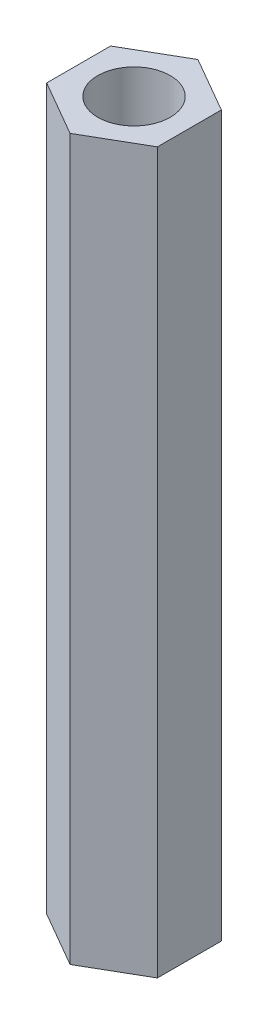
ISO-10303-21;
HEADER;
FILE_DESCRIPTION(('STEP AP214'),'2;1');
FILE_NAME('part.step','',(''),(''),'','','');
FILE_SCHEMA(('AUTOMOTIVE_DESIGN { 1 0 10303 214 1 1 1 1 }'));
ENDSEC;
DATA;
#1=APPLICATION_CONTEXT('core data for automotive mechanical design processes');
#2=APPLICATION_PROTOCOL_DEFINITION('international standard','automotive_design',2000,#1);
#3=PRODUCT_CONTEXT('',#1,'mechanical');
#4=PRODUCT('Part','Part','',(#3));
#5=PRODUCT_RELATED_PRODUCT_CATEGORY('part','',(#4));
#6=PRODUCT_DEFINITION_FORMATION('','',#4);
#7=PRODUCT_DEFINITION_CONTEXT('part definition',#1,'design');
#8=PRODUCT_DEFINITION('design','',#6,#7);
#9=PRODUCT_DEFINITION_SHAPE('','',#8);
#10=(LENGTH_UNIT() NAMED_UNIT(*) SI_UNIT(.MILLI.,.METRE.));
#11=(NAMED_UNIT(*) PLANE_ANGLE_UNIT() SI_UNIT($,.RADIAN.));
#12=(NAMED_UNIT(*) SI_UNIT($,.STERADIAN.) SOLID_ANGLE_UNIT());
#13=UNCERTAINTY_MEASURE_WITH_UNIT(LENGTH_MEASURE(1.E-05),#10,'distance_accuracy_value','');
#14=(GEOMETRIC_REPRESENTATION_CONTEXT(3) GLOBAL_UNCERTAINTY_ASSIGNED_CONTEXT((#13)) GLOBAL_UNIT_ASSIGNED_CONTEXT((#10,
#11,#12)) REPRESENTATION_CONTEXT('',''));
#15=CARTESIAN_POINT('',(0.,0.,0.));
#16=DIRECTION('',(0.,0.,1.));
#17=DIRECTION('',(1.,0.,0.));
#18=AXIS2_PLACEMENT_3D('',#15,#16,#17);
#19=CARTESIAN_POINT('',(0.,32.5,0.));
#20=DIRECTION('',(0.,-1.,0.));
#21=DIRECTION('',(0.,0.,-1.));
#22=AXIS2_PLACEMENT_3D('',#19,#20,#21);
#23=PLANE('',#22);
#24=DIRECTION('',(-0.86602542888642,0.,-0.49999995652209));
#25=VECTOR('',#24,1.);
#26=CARTESIAN_POINT('',(-1.44938846189692E-07,32.5,-2.887));
#27=LINE('',#26,#25);
#28=CARTESIAN_POINT('',(2.50021526825625,32.5,-1.44350012552072));
#29=VERTEX_POINT('',#28);
#30=CARTESIAN_POINT('',(-1.44938846189692E-07,32.5,-2.887));
#31=VERTEX_POINT('',#30);
#32=EDGE_CURVE('E130',#29,#31,#27,.T.);
#33=ORIENTED_EDGE('',*,*,#32,.T.);
#34=DIRECTION('',(-0.866025378682455,0.,0.500000043477908));
#35=VECTOR('',#34,1.);
#36=CARTESIAN_POINT('',(-2.50021541319509,32.5,-1.44349987447928));
#37=LINE('',#36,#35);
#38=CARTESIAN_POINT('',(-2.50021541319509,32.5,-1.44349987447928));
#39=VERTEX_POINT('',#38);
#40=EDGE_CURVE('E88',#31,#39,#37,.T.);
#41=ORIENTED_EDGE('',*,*,#40,.T.);
#42=DIRECTION('',(5.02039646973577E-08,0.,0.999999999999999));
#43=VECTOR('',#42,1.);
#44=CARTESIAN_POINT('',(-2.50021526825625,32.5,1.44350012552072));
#45=LINE('',#44,#43);
#46=CARTESIAN_POINT('',(-2.50021526825625,32.5,1.44350012552072));
#47=VERTEX_POINT('',#46);
#48=EDGE_CURVE('E101',#39,#47,#45,.T.);
#49=ORIENTED_EDGE('',*,*,#48,.T.);
#50=DIRECTION('',(0.86602542888642,0.,0.49999995652209));
#51=VECTOR('',#50,1.);
#52=CARTESIAN_POINT('',(1.44938846487848E-07,32.5,2.887));
#53=LINE('',#52,#51);
#54=CARTESIAN_POINT('',(1.44938846487848E-07,32.5,2.887));
#55=VERTEX_POINT('',#54);
#56=EDGE_CURVE('E95',#47,#55,#53,.T.);
#57=ORIENTED_EDGE('',*,*,#56,.T.);
#58=DIRECTION('',(0.866025378682455,0.,-0.500000043477908));
#59=VECTOR('',#58,1.);
#60=CARTESIAN_POINT('',(2.50021541319509,32.5,1.44349987447928));
#61=LINE('',#60,#59);
#62=CARTESIAN_POINT('',(2.50021541319509,32.5,1.44349987447928));
#63=VERTEX_POINT('',#62);
#64=EDGE_CURVE('E99',#55,#63,#61,.T.);
#65=ORIENTED_EDGE('',*,*,#64,.T.);
#66=DIRECTION('',(-5.02039645471391E-08,0.,-0.999999999999999));
#67=VECTOR('',#66,1.);
#68=CARTESIAN_POINT('',(2.50021526825625,32.5,-1.44350012552072));
#69=LINE('',#68,#67);
#70=EDGE_CURVE('E51',#63,#29,#69,.T.);
#71=ORIENTED_EDGE('',*,*,#70,.T.);
#72=EDGE_LOOP('',(#33,#41,#49,#57,#65,#71));
#73=FACE_BOUND('',#72,.T.);
#74=CARTESIAN_POINT('',(0.,32.5,0.));
#75=DIRECTION('',(0.,1.,0.));
#76=DIRECTION('',(0.,0.,1.));
#77=AXIS2_PLACEMENT_3D('',#74,#75,#76);
#78=CIRCLE('',#77,1.635);
#79=CARTESIAN_POINT('',(0.,32.5,1.635));
#80=VERTEX_POINT('',#79);
#81=EDGE_CURVE('E123',#80,#80,#78,.T.);
#82=ORIENTED_EDGE('',*,*,#81,.F.);
#83=EDGE_LOOP('',(#82));
#84=FACE_BOUND('',#83,.T.);
#85=ADVANCED_FACE('F34',(#73,#84),#23,.F.);
#86=CARTESIAN_POINT('',(0.,0.,0.));
#87=DIRECTION('',(0.,-1.,0.));
#88=DIRECTION('',(0.,0.,-1.));
#89=AXIS2_PLACEMENT_3D('',#86,#87,#88);
#90=PLANE('',#89);
#91=DIRECTION('',(-0.86602542888642,0.,-0.49999995652209));
#92=VECTOR('',#91,1.);
#93=CARTESIAN_POINT('',(-1.44938846189692E-07,0.,-2.887));
#94=LINE('',#93,#92);
#95=CARTESIAN_POINT('',(2.50021526825625,0.,-1.44350012552072));
#96=VERTEX_POINT('',#95);
#97=CARTESIAN_POINT('',(-1.44938846189692E-07,0.,-2.887));
#98=VERTEX_POINT('',#97);
#99=EDGE_CURVE('E119',#96,#98,#94,.T.);
#100=ORIENTED_EDGE('',*,*,#99,.F.);
#101=DIRECTION('',(-5.02039645471391E-08,0.,-0.999999999999999));
#102=VECTOR('',#101,1.);
#103=CARTESIAN_POINT('',(2.50021526825625,0.,-1.44350012552072));
#104=LINE('',#103,#102);
#105=CARTESIAN_POINT('',(2.50021541319509,0.,1.44349987447928));
#106=VERTEX_POINT('',#105);
#107=EDGE_CURVE('E80',#106,#96,#104,.T.);
#108=ORIENTED_EDGE('',*,*,#107,.F.);
#109=DIRECTION('',(0.866025378682455,0.,-0.500000043477908));
#110=VECTOR('',#109,1.);
#111=CARTESIAN_POINT('',(2.50021541319509,0.,1.44349987447928));
#112=LINE('',#111,#110);
#113=CARTESIAN_POINT('',(1.44938846487848E-07,0.,2.887));
#114=VERTEX_POINT('',#113);
#115=EDGE_CURVE('E74',#114,#106,#112,.T.);
#116=ORIENTED_EDGE('',*,*,#115,.F.);
#117=DIRECTION('',(0.86602542888642,0.,0.49999995652209));
#118=VECTOR('',#117,1.);
#119=CARTESIAN_POINT('',(1.44938846487848E-07,0.,2.887));
#120=LINE('',#119,#118);
#121=CARTESIAN_POINT('',(-2.50021526825625,0.,1.44350012552072));
#122=VERTEX_POINT('',#121);
#123=EDGE_CURVE('E109',#122,#114,#120,.T.);
#124=ORIENTED_EDGE('',*,*,#123,.F.);
#125=DIRECTION('',(5.02039646973577E-08,0.,0.999999999999999));
#126=VECTOR('',#125,1.);
#127=CARTESIAN_POINT('',(-2.50021526825625,0.,1.44350012552072));
#128=LINE('',#127,#126);
#129=CARTESIAN_POINT('',(-2.50021541319509,0.,-1.44349987447928));
#130=VERTEX_POINT('',#129);
#131=EDGE_CURVE('E125',#130,#122,#128,.T.);
#132=ORIENTED_EDGE('',*,*,#131,.F.);
#133=DIRECTION('',(-0.866025378682455,0.,0.500000043477908));
#134=VECTOR('',#133,1.);
#135=CARTESIAN_POINT('',(-2.50021541319509,0.,-1.44349987447928));
#136=LINE('',#135,#134);
#137=EDGE_CURVE('E122',#98,#130,#136,.T.);
#138=ORIENTED_EDGE('',*,*,#137,.F.);
#139=EDGE_LOOP('',(#100,#108,#116,#124,#132,#138));
#140=FACE_BOUND('',#139,.T.);
#141=CARTESIAN_POINT('',(0.,0.,0.));
#142=DIRECTION('',(0.,1.,0.));
#143=DIRECTION('',(0.,0.,1.));
#144=AXIS2_PLACEMENT_3D('',#141,#142,#143);
#145=CIRCLE('',#144,1.635);
#146=CARTESIAN_POINT('',(0.,0.,1.635));
#147=VERTEX_POINT('',#146);
#148=EDGE_CURVE('E223',#147,#147,#145,.T.);
#149=ORIENTED_EDGE('',*,*,#148,.T.);
#150=EDGE_LOOP('',(#149));
#151=FACE_BOUND('',#150,.T.);
#152=ADVANCED_FACE('F139',(#140,#151),#90,.T.);
#153=CARTESIAN_POINT('',(-1.44938846189692E-07,32.5,-2.887));
#154=DIRECTION('',(-0.49999995652209,0.,0.86602542888642));
#155=DIRECTION('',(0.86602542888642,0.,0.49999995652209));
#156=AXIS2_PLACEMENT_3D('',#153,#154,#155);
#157=PLANE('',#156);
#158=ORIENTED_EDGE('',*,*,#99,.T.);
#159=DIRECTION('',(0.,-1.,0.));
#160=VECTOR('',#159,1.);
#161=CARTESIAN_POINT('',(-1.44938846189692E-07,32.5,-2.887));
#162=LINE('',#161,#160);
#163=EDGE_CURVE('E11',#31,#98,#162,.T.);
#164=ORIENTED_EDGE('',*,*,#163,.F.);
#165=ORIENTED_EDGE('',*,*,#32,.F.);
#166=DIRECTION('',(0.,-1.,0.));
#167=VECTOR('',#166,1.);
#168=CARTESIAN_POINT('',(2.50021526825625,32.5,-1.44350012552072));
#169=LINE('',#168,#167);
#170=EDGE_CURVE('E115',#29,#96,#169,.T.);
#171=ORIENTED_EDGE('',*,*,#170,.T.);
#172=EDGE_LOOP('',(#158,#164,#165,#171));
#173=FACE_BOUND('',#172,.T.);
#174=ADVANCED_FACE('F36',(#173),#157,.F.);
#175=CARTESIAN_POINT('',(-2.50021541319509,32.5,-1.44349987447928));
#176=DIRECTION('',(0.500000043477908,0.,0.866025378682455));
#177=DIRECTION('',(0.866025378682455,0.,-0.500000043477908));
#178=AXIS2_PLACEMENT_3D('',#175,#176,#177);
#179=PLANE('',#178);
#180=ORIENTED_EDGE('',*,*,#137,.T.);
#181=DIRECTION('',(0.,-1.,0.));
#182=VECTOR('',#181,1.);
#183=CARTESIAN_POINT('',(-2.50021541319509,32.5,-1.44349987447928));
#184=LINE('',#183,#182);
#185=EDGE_CURVE('E43',#39,#130,#184,.T.);
#186=ORIENTED_EDGE('',*,*,#185,.F.);
#187=ORIENTED_EDGE('',*,*,#40,.F.);
#188=ORIENTED_EDGE('',*,*,#163,.T.);
#189=EDGE_LOOP('',(#180,#186,#187,#188));
#190=FACE_BOUND('',#189,.T.);
#191=ADVANCED_FACE('F164',(#190),#179,.F.);
#192=CARTESIAN_POINT('',(-2.50021526825625,32.5,1.44350012552072));
#193=DIRECTION('',(0.999999999999999,0.,-5.02039646973576E-08));
#194=DIRECTION('',(-5.02039646973577E-08,0.,-0.999999999999999));
#195=AXIS2_PLACEMENT_3D('',#192,#193,#194);
#196=PLANE('',#195);
#197=ORIENTED_EDGE('',*,*,#131,.T.);
#198=DIRECTION('',(0.,-1.,0.));
#199=VECTOR('',#198,1.);
#200=CARTESIAN_POINT('',(-2.50021526825625,32.5,1.44350012552072));
#201=LINE('',#200,#199);
#202=EDGE_CURVE('E110',#47,#122,#201,.T.);
#203=ORIENTED_EDGE('',*,*,#202,.F.);
#204=ORIENTED_EDGE('',*,*,#48,.F.);
#205=ORIENTED_EDGE('',*,*,#185,.T.);
#206=EDGE_LOOP('',(#197,#203,#204,#205));
#207=FACE_BOUND('',#206,.T.);
#208=ADVANCED_FACE('F136',(#207),#196,.F.);
#209=CARTESIAN_POINT('',(1.44938846487848E-07,32.5,2.887));
#210=DIRECTION('',(0.49999995652209,0.,-0.86602542888642));
#211=DIRECTION('',(-0.86602542888642,0.,-0.49999995652209));
#212=AXIS2_PLACEMENT_3D('',#209,#210,#211);
#213=PLANE('',#212);
#214=ORIENTED_EDGE('',*,*,#123,.T.);
#215=DIRECTION('',(0.,-1.,0.));
#216=VECTOR('',#215,1.);
#217=CARTESIAN_POINT('',(1.44938846487848E-07,32.5,2.887));
#218=LINE('',#217,#216);
#219=EDGE_CURVE('E106',#55,#114,#218,.T.);
#220=ORIENTED_EDGE('',*,*,#219,.F.);
#221=ORIENTED_EDGE('',*,*,#56,.F.);
#222=ORIENTED_EDGE('',*,*,#202,.T.);
#223=EDGE_LOOP('',(#214,#220,#221,#222));
#224=FACE_BOUND('',#223,.T.);
#225=ADVANCED_FACE('F107',(#224),#213,.F.);
#226=CARTESIAN_POINT('',(2.50021541319509,32.5,1.44349987447928));
#227=DIRECTION('',(-0.500000043477908,0.,-0.866025378682455));
#228=DIRECTION('',(-0.866025378682455,0.,0.500000043477908));
#229=AXIS2_PLACEMENT_3D('',#226,#227,#228);
#230=PLANE('',#229);
#231=ORIENTED_EDGE('',*,*,#115,.T.);
#232=DIRECTION('',(0.,-1.,0.));
#233=VECTOR('',#232,1.);
#234=CARTESIAN_POINT('',(2.50021541319509,32.5,1.44349987447928));
#235=LINE('',#234,#233);
#236=EDGE_CURVE('E111',#63,#106,#235,.T.);
#237=ORIENTED_EDGE('',*,*,#236,.F.);
#238=ORIENTED_EDGE('',*,*,#64,.F.);
#239=ORIENTED_EDGE('',*,*,#219,.T.);
#240=EDGE_LOOP('',(#231,#237,#238,#239));
#241=FACE_BOUND('',#240,.T.);
#242=ADVANCED_FACE('F113',(#241),#230,.F.);
#243=CARTESIAN_POINT('',(2.50021526825625,32.5,-1.44350012552072));
#244=DIRECTION('',(-0.999999999999999,0.,5.02039645471391E-08));
#245=DIRECTION('',(5.02039645471391E-08,0.,0.999999999999999));
#246=AXIS2_PLACEMENT_3D('',#243,#244,#245);
#247=PLANE('',#246);
#248=ORIENTED_EDGE('',*,*,#107,.T.);
#249=ORIENTED_EDGE('',*,*,#170,.F.);
#250=ORIENTED_EDGE('',*,*,#70,.F.);
#251=ORIENTED_EDGE('',*,*,#236,.T.);
#252=EDGE_LOOP('',(#248,#249,#250,#251));
#253=FACE_BOUND('',#252,.T.);
#254=ADVANCED_FACE('F144',(#253),#247,.F.);
#255=CARTESIAN_POINT('',(0.,32.5,0.));
#256=DIRECTION('',(0.,-1.,0.));
#257=DIRECTION('',(0.,0.,-1.));
#258=AXIS2_PLACEMENT_3D('',#255,#256,#257);
#259=CYLINDRICAL_SURFACE('',#258,1.635);
#260=ORIENTED_EDGE('',*,*,#81,.T.);
#261=EDGE_LOOP('',(#260));
#262=FACE_BOUND('',#261,.T.);
#263=ORIENTED_EDGE('',*,*,#148,.F.);
#264=EDGE_LOOP('',(#263));
#265=FACE_BOUND('',#264,.T.);
#266=ADVANCED_FACE('F146',(#262,#265),#259,.F.);
#267=CLOSED_SHELL('',(#85,#152,#174,#191,#208,#225,#242,#254,#266));
#268=MANIFOLD_SOLID_BREP('B2',#267);
#269=ADVANCED_BREP_SHAPE_REPRESENTATION('',(#18,#268),#14);
#270=SHAPE_DEFINITION_REPRESENTATION(#9,#269);
ENDSEC;
END-ISO-10303-21;
